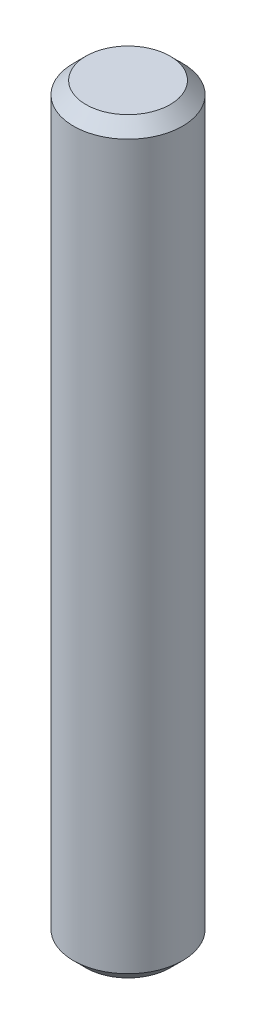
ISO-10303-21;
HEADER;
FILE_DESCRIPTION(('STEP AP214'),'2;1');
FILE_NAME('part.step','',(''),(''),'','','');
FILE_SCHEMA(('AUTOMOTIVE_DESIGN { 1 0 10303 214 1 1 1 1 }'));
ENDSEC;
DATA;
#1=APPLICATION_CONTEXT('core data for automotive mechanical design processes');
#2=APPLICATION_PROTOCOL_DEFINITION('international standard','automotive_design',2000,#1);
#3=PRODUCT_CONTEXT('',#1,'mechanical');
#4=PRODUCT('Part','Part','',(#3));
#5=PRODUCT_RELATED_PRODUCT_CATEGORY('part','',(#4));
#6=PRODUCT_DEFINITION_FORMATION('','',#4);
#7=PRODUCT_DEFINITION_CONTEXT('part definition',#1,'design');
#8=PRODUCT_DEFINITION('design','',#6,#7);
#9=PRODUCT_DEFINITION_SHAPE('','',#8);
#10=(LENGTH_UNIT() NAMED_UNIT(*) SI_UNIT(.MILLI.,.METRE.));
#11=(NAMED_UNIT(*) PLANE_ANGLE_UNIT() SI_UNIT($,.RADIAN.));
#12=(NAMED_UNIT(*) SI_UNIT($,.STERADIAN.) SOLID_ANGLE_UNIT());
#13=UNCERTAINTY_MEASURE_WITH_UNIT(LENGTH_MEASURE(1.E-05),#10,'distance_accuracy_value','');
#14=(GEOMETRIC_REPRESENTATION_CONTEXT(3) GLOBAL_UNCERTAINTY_ASSIGNED_CONTEXT((#13)) GLOBAL_UNIT_ASSIGNED_CONTEXT((#10,
#11,#12)) REPRESENTATION_CONTEXT('',''));
#15=CARTESIAN_POINT('',(0.,0.,0.));
#16=DIRECTION('',(0.,0.,1.));
#17=DIRECTION('',(1.,0.,0.));
#18=AXIS2_PLACEMENT_3D('',#15,#16,#17);
#19=CARTESIAN_POINT('',(-7.5114002607629,-26.9496605001348,21.0660001071556));
#20=DIRECTION('',(0.,-1.,0.));
#21=DIRECTION('',(1.,0.,0.));
#22=AXIS2_PLACEMENT_3D('',#19,#20,#21);
#23=PLANE('',#22);
#24=CARTESIAN_POINT('',(-35.0000005215401,-26.9496605001559,21.0000003129244));
#25=DIRECTION('',(0.,1.,0.));
#26=DIRECTION('',(-1.,0.,0.));
#27=AXIS2_PLACEMENT_3D('',#24,#25,#26);
#28=CIRCLE('',#27,1.34999999994533);
#29=CARTESIAN_POINT('',(-36.3500005214854,-26.9496605001559,21.0000003129244));
#30=VERTEX_POINT('',#29);
#31=EDGE_CURVE('E17',#30,#30,#28,.T.);
#32=ORIENTED_EDGE('',*,*,#31,.F.);
#33=EDGE_LOOP('',(#32));
#34=FACE_BOUND('',#33,.T.);
#35=ADVANCED_FACE('F14',(#34),#23,.T.);
#36=CARTESIAN_POINT('',(-7.51140026076342,-2.94966050013478,21.0660001071556));
#37=DIRECTION('',(0.,-1.,0.));
#38=DIRECTION('',(1.,0.,0.));
#39=AXIS2_PLACEMENT_3D('',#36,#37,#38);
#40=PLANE('',#39);
#41=CARTESIAN_POINT('',(-35.0000005215406,-2.94966050023504,21.0000003129244));
#42=DIRECTION('',(0.,-1.,0.));
#43=DIRECTION('',(1.,0.,0.));
#44=AXIS2_PLACEMENT_3D('',#41,#42,#43);
#45=CIRCLE('',#44,1.35000000009306);
#46=CARTESIAN_POINT('',(-33.6500005214475,-2.94966050023501,21.0000003129244));
#47=VERTEX_POINT('',#46);
#48=EDGE_CURVE('E26',#47,#47,#45,.T.);
#49=ORIENTED_EDGE('',*,*,#48,.F.);
#50=EDGE_LOOP('',(#49));
#51=FACE_BOUND('',#50,.T.);
#52=ADVANCED_FACE('F37',(#51),#40,.F.);
#53=CARTESIAN_POINT('',(-35.0000005215401,-26.5496605002227,21.0000003129244));
#54=DIRECTION('',(0.,1.,0.));
#55=DIRECTION('',(-1.,0.,0.));
#56=AXIS2_PLACEMENT_3D('',#53,#54,#55);
#57=CONICAL_SURFACE('',#56,1.7499999998785,0.78539816339747);
#58=CARTESIAN_POINT('',(-35.0000005215401,-26.5496605001354,21.0000003129244));
#59=DIRECTION('',(0.,-1.,0.));
#60=DIRECTION('',(1.,0.,0.));
#61=AXIS2_PLACEMENT_3D('',#58,#59,#60);
#62=CIRCLE('',#61,1.75);
#63=CARTESIAN_POINT('',(-33.2500005215401,-26.5496605001353,21.0000003129244));
#64=VERTEX_POINT('',#63);
#65=EDGE_CURVE('E21',#64,#64,#62,.F.);
#66=ORIENTED_EDGE('',*,*,#65,.F.);
#67=EDGE_LOOP('',(#66));
#68=FACE_BOUND('',#67,.T.);
#69=ORIENTED_EDGE('',*,*,#31,.T.);
#70=EDGE_LOOP('',(#69));
#71=FACE_BOUND('',#70,.T.);
#72=ADVANCED_FACE('F34',(#68,#71),#57,.T.);
#73=CARTESIAN_POINT('',(-35.0000005215406,-3.34966050007783,21.0000003129244));
#74=DIRECTION('',(0.,-1.,0.));
#75=DIRECTION('',(1.,0.,0.));
#76=AXIS2_PLACEMENT_3D('',#73,#74,#75);
#77=CONICAL_SURFACE('',#76,1.74999999993583,0.785398163397429);
#78=ORIENTED_EDGE('',*,*,#48,.T.);
#79=EDGE_LOOP('',(#78));
#80=FACE_BOUND('',#79,.T.);
#81=CARTESIAN_POINT('',(-35.0000005215406,-3.34966050013539,21.0000003129244));
#82=DIRECTION('',(0.,-1.,0.));
#83=DIRECTION('',(1.,0.,0.));
#84=AXIS2_PLACEMENT_3D('',#81,#82,#83);
#85=CIRCLE('',#84,1.75);
#86=CARTESIAN_POINT('',(-33.2500005215406,-3.34966050013535,21.0000003129244));
#87=VERTEX_POINT('',#86);
#88=EDGE_CURVE('E10',#87,#87,#85,.T.);
#89=ORIENTED_EDGE('',*,*,#88,.F.);
#90=EDGE_LOOP('',(#89));
#91=FACE_BOUND('',#90,.T.);
#92=ADVANCED_FACE('F45',(#80,#91),#77,.T.);
#93=CARTESIAN_POINT('',(-35.0000005215406,-2.94966050013539,21.0000003129244));
#94=DIRECTION('',(0.,-1.,0.));
#95=DIRECTION('',(1.,0.,0.));
#96=AXIS2_PLACEMENT_3D('',#93,#94,#95);
#97=CYLINDRICAL_SURFACE('',#96,1.75);
#98=ORIENTED_EDGE('',*,*,#88,.T.);
#99=EDGE_LOOP('',(#98));
#100=FACE_BOUND('',#99,.T.);
#101=ORIENTED_EDGE('',*,*,#65,.T.);
#102=EDGE_LOOP('',(#101));
#103=FACE_BOUND('',#102,.T.);
#104=ADVANCED_FACE('F43',(#100,#103),#97,.T.);
#105=CLOSED_SHELL('',(#35,#52,#72,#92,#104));
#106=MANIFOLD_SOLID_BREP('B1',#105);
#107=ADVANCED_BREP_SHAPE_REPRESENTATION('',(#18,#106),#14);
#108=SHAPE_DEFINITION_REPRESENTATION(#9,#107);
ENDSEC;
END-ISO-10303-21;
